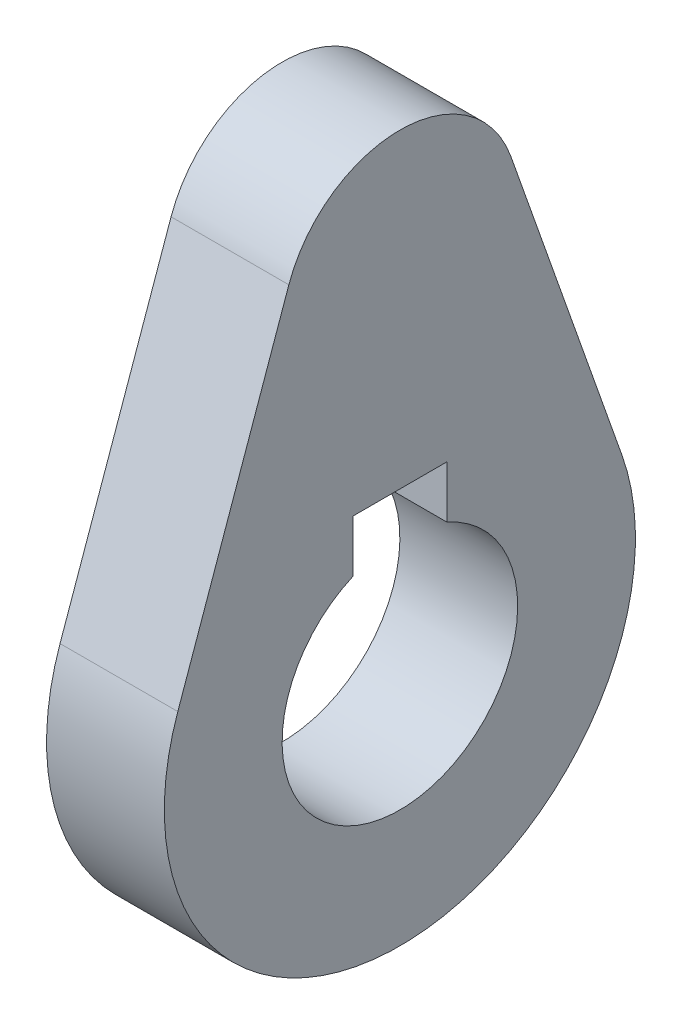
ISO-10303-21;
HEADER;
FILE_DESCRIPTION(('STEP AP214'),'2;1');
FILE_NAME('part.step','',(''),(''),'','','');
FILE_SCHEMA(('AUTOMOTIVE_DESIGN { 1 0 10303 214 1 1 1 1 }'));
ENDSEC;
DATA;
#1=APPLICATION_CONTEXT('core data for automotive mechanical design processes');
#2=APPLICATION_PROTOCOL_DEFINITION('international standard','automotive_design',2000,#1);
#3=PRODUCT_CONTEXT('',#1,'mechanical');
#4=PRODUCT('Part','Part','',(#3));
#5=PRODUCT_RELATED_PRODUCT_CATEGORY('part','',(#4));
#6=PRODUCT_DEFINITION_FORMATION('','',#4);
#7=PRODUCT_DEFINITION_CONTEXT('part definition',#1,'design');
#8=PRODUCT_DEFINITION('design','',#6,#7);
#9=PRODUCT_DEFINITION_SHAPE('','',#8);
#10=(LENGTH_UNIT() NAMED_UNIT(*) SI_UNIT(.MILLI.,.METRE.));
#11=(NAMED_UNIT(*) PLANE_ANGLE_UNIT() SI_UNIT($,.RADIAN.));
#12=(NAMED_UNIT(*) SI_UNIT($,.STERADIAN.) SOLID_ANGLE_UNIT());
#13=UNCERTAINTY_MEASURE_WITH_UNIT(LENGTH_MEASURE(1.E-05),#10,'distance_accuracy_value','');
#14=(GEOMETRIC_REPRESENTATION_CONTEXT(3) GLOBAL_UNCERTAINTY_ASSIGNED_CONTEXT((#13)) GLOBAL_UNIT_ASSIGNED_CONTEXT((#10,
#11,#12)) REPRESENTATION_CONTEXT('',''));
#15=CARTESIAN_POINT('',(0.,0.,0.));
#16=DIRECTION('',(0.,0.,1.));
#17=DIRECTION('',(1.,0.,0.));
#18=AXIS2_PLACEMENT_3D('',#15,#16,#17);
#19=CARTESIAN_POINT('',(5.,0.,0.));
#20=DIRECTION('',(-1.,0.,0.));
#21=DIRECTION('',(0.,0.,1.));
#22=AXIS2_PLACEMENT_3D('',#19,#20,#21);
#23=CYLINDRICAL_SURFACE('',#22,10.);
#24=CARTESIAN_POINT('',(0.,0.,0.));
#25=DIRECTION('',(1.,0.,0.));
#26=DIRECTION('',(0.,0.,-1.));
#27=AXIS2_PLACEMENT_3D('',#24,#25,#26);
#28=CIRCLE('',#27,10.);
#29=CARTESIAN_POINT('',(0.,3.33333333333333,9.42809041582063));
#30=VERTEX_POINT('',#29);
#31=CARTESIAN_POINT('',(0.,3.33333333333333,-9.42809041582064));
#32=VERTEX_POINT('',#31);
#33=EDGE_CURVE('E144',#30,#32,#28,.T.);
#34=ORIENTED_EDGE('',*,*,#33,.T.);
#35=DIRECTION('',(-1.,0.,0.));
#36=VECTOR('',#35,1.);
#37=CARTESIAN_POINT('',(5.,3.33333333333333,-9.42809041582064));
#38=LINE('',#37,#36);
#39=CARTESIAN_POINT('',(5.,3.33333333333333,-9.42809041582064));
#40=VERTEX_POINT('',#39);
#41=EDGE_CURVE('E11',#40,#32,#38,.T.);
#42=ORIENTED_EDGE('',*,*,#41,.F.);
#43=CARTESIAN_POINT('',(5.,0.,0.));
#44=DIRECTION('',(1.,0.,0.));
#45=DIRECTION('',(0.,0.,-1.));
#46=AXIS2_PLACEMENT_3D('',#43,#44,#45);
#47=CIRCLE('',#46,10.);
#48=CARTESIAN_POINT('',(5.,3.33333333333333,9.42809041582063));
#49=VERTEX_POINT('',#48);
#50=EDGE_CURVE('E123',#49,#40,#47,.T.);
#51=ORIENTED_EDGE('',*,*,#50,.F.);
#52=DIRECTION('',(-1.,0.,0.));
#53=VECTOR('',#52,1.);
#54=CARTESIAN_POINT('',(5.,3.33333333333333,9.42809041582063));
#55=LINE('',#54,#53);
#56=EDGE_CURVE('E151',#49,#30,#55,.T.);
#57=ORIENTED_EDGE('',*,*,#56,.T.);
#58=EDGE_LOOP('',(#34,#42,#51,#57));
#59=FACE_BOUND('',#58,.T.);
#60=ADVANCED_FACE('F35',(#59),#23,.T.);
#61=CARTESIAN_POINT('',(5.,3.33333333333333,-9.42809041582064));
#62=DIRECTION('',(0.,0.333333333333333,-0.942809041582063));
#63=DIRECTION('',(0.,0.942809041582063,0.333333333333333));
#64=AXIS2_PLACEMENT_3D('',#61,#62,#63);
#65=PLANE('',#64);
#66=DIRECTION('',(0.,-0.942809041582063,-0.333333333333333));
#67=VECTOR('',#66,1.);
#68=CARTESIAN_POINT('',(0.,3.33333333333333,-9.42809041582064));
#69=LINE('',#68,#67);
#70=CARTESIAN_POINT('',(0.,16.6666666666667,-4.71404520791032));
#71=VERTEX_POINT('',#70);
#72=EDGE_CURVE('E115',#71,#32,#69,.T.);
#73=ORIENTED_EDGE('',*,*,#72,.F.);
#74=DIRECTION('',(-1.,0.,0.));
#75=VECTOR('',#74,1.);
#76=CARTESIAN_POINT('',(5.,16.6666666666667,-4.71404520791032));
#77=LINE('',#76,#75);
#78=CARTESIAN_POINT('',(5.,16.6666666666667,-4.71404520791032));
#79=VERTEX_POINT('',#78);
#80=EDGE_CURVE('E45',#79,#71,#77,.T.);
#81=ORIENTED_EDGE('',*,*,#80,.F.);
#82=DIRECTION('',(0.,-0.942809041582063,-0.333333333333333));
#83=VECTOR('',#82,1.);
#84=CARTESIAN_POINT('',(5.,3.33333333333333,-9.42809041582064));
#85=LINE('',#84,#83);
#86=EDGE_CURVE('E113',#79,#40,#85,.T.);
#87=ORIENTED_EDGE('',*,*,#86,.T.);
#88=ORIENTED_EDGE('',*,*,#41,.T.);
#89=EDGE_LOOP('',(#73,#81,#87,#88));
#90=FACE_BOUND('',#89,.T.);
#91=ADVANCED_FACE('F111',(#90),#65,.T.);
#92=CARTESIAN_POINT('',(5.,15.,0.));
#93=DIRECTION('',(-1.,0.,0.));
#94=DIRECTION('',(0.,0.,1.));
#95=AXIS2_PLACEMENT_3D('',#92,#93,#94);
#96=CYLINDRICAL_SURFACE('',#95,5.);
#97=CARTESIAN_POINT('',(0.,15.,0.));
#98=DIRECTION('',(1.,0.,0.));
#99=DIRECTION('',(0.,0.,-1.));
#100=AXIS2_PLACEMENT_3D('',#97,#98,#99);
#101=CIRCLE('',#100,5.);
#102=CARTESIAN_POINT('',(0.,16.6666666666667,4.71404520791032));
#103=VERTEX_POINT('',#102);
#104=EDGE_CURVE('E81',#71,#103,#101,.T.);
#105=ORIENTED_EDGE('',*,*,#104,.T.);
#106=DIRECTION('',(-1.,0.,0.));
#107=VECTOR('',#106,1.);
#108=CARTESIAN_POINT('',(5.,16.6666666666667,4.71404520791032));
#109=LINE('',#108,#107);
#110=CARTESIAN_POINT('',(5.,16.6666666666667,4.71404520791032));
#111=VERTEX_POINT('',#110);
#112=EDGE_CURVE('E116',#111,#103,#109,.T.);
#113=ORIENTED_EDGE('',*,*,#112,.F.);
#114=CARTESIAN_POINT('',(5.,15.,0.));
#115=DIRECTION('',(1.,0.,0.));
#116=DIRECTION('',(0.,0.,-1.));
#117=AXIS2_PLACEMENT_3D('',#114,#115,#116);
#118=CIRCLE('',#117,5.);
#119=EDGE_CURVE('E118',#79,#111,#118,.T.);
#120=ORIENTED_EDGE('',*,*,#119,.F.);
#121=ORIENTED_EDGE('',*,*,#80,.T.);
#122=EDGE_LOOP('',(#105,#113,#120,#121));
#123=FACE_BOUND('',#122,.T.);
#124=ADVANCED_FACE('F119',(#123),#96,.T.);
#125=CARTESIAN_POINT('',(5.,0.,0.));
#126=DIRECTION('',(-1.,0.,0.));
#127=DIRECTION('',(0.,0.,1.));
#128=AXIS2_PLACEMENT_3D('',#125,#126,#127);
#129=CYLINDRICAL_SURFACE('',#128,5.);
#130=CARTESIAN_POINT('',(0.,0.,0.));
#131=DIRECTION('',(1.,0.,0.));
#132=DIRECTION('',(0.,0.,-1.));
#133=AXIS2_PLACEMENT_3D('',#130,#131,#132);
#134=CIRCLE('',#133,5.);
#135=CARTESIAN_POINT('',(0.,4.58257569495584,2.));
#136=VERTEX_POINT('',#135);
#137=CARTESIAN_POINT('',(0.,4.58257569495584,-2.));
#138=VERTEX_POINT('',#137);
#139=EDGE_CURVE('E132',#136,#138,#134,.T.);
#140=ORIENTED_EDGE('',*,*,#139,.F.);
#141=DIRECTION('',(-1.,0.,0.));
#142=VECTOR('',#141,1.);
#143=CARTESIAN_POINT('',(5.,4.58257569495584,2.));
#144=LINE('',#143,#142);
#145=CARTESIAN_POINT('',(5.,4.58257569495584,2.));
#146=VERTEX_POINT('',#145);
#147=EDGE_CURVE('E39',#146,#136,#144,.T.);
#148=ORIENTED_EDGE('',*,*,#147,.F.);
#149=CARTESIAN_POINT('',(5.,0.,0.));
#150=DIRECTION('',(1.,0.,0.));
#151=DIRECTION('',(0.,0.,-1.));
#152=AXIS2_PLACEMENT_3D('',#149,#150,#151);
#153=CIRCLE('',#152,5.);
#154=CARTESIAN_POINT('',(5.,4.58257569495584,-2.));
#155=VERTEX_POINT('',#154);
#156=EDGE_CURVE('E150',#146,#155,#153,.T.);
#157=ORIENTED_EDGE('',*,*,#156,.T.);
#158=DIRECTION('',(-1.,0.,0.));
#159=VECTOR('',#158,1.);
#160=CARTESIAN_POINT('',(5.,4.58257569495584,-2.));
#161=LINE('',#160,#159);
#162=EDGE_CURVE('E131',#155,#138,#161,.T.);
#163=ORIENTED_EDGE('',*,*,#162,.T.);
#164=EDGE_LOOP('',(#140,#148,#157,#163));
#165=FACE_BOUND('',#164,.T.);
#166=ADVANCED_FACE('F37',(#165),#129,.F.);
#167=CARTESIAN_POINT('',(5.,0.,2.));
#168=DIRECTION('',(0.,0.,1.));
#169=DIRECTION('',(1.,0.,0.));
#170=AXIS2_PLACEMENT_3D('',#167,#168,#169);
#171=PLANE('',#170);
#172=DIRECTION('',(0.,1.,0.));
#173=VECTOR('',#172,1.);
#174=CARTESIAN_POINT('',(0.,0.,2.));
#175=LINE('',#174,#173);
#176=CARTESIAN_POINT('',(0.,6.80206586266261,2.));
#177=VERTEX_POINT('',#176);
#178=EDGE_CURVE('E135',#136,#177,#175,.T.);
#179=ORIENTED_EDGE('',*,*,#178,.T.);
#180=DIRECTION('',(-1.,0.,0.));
#181=VECTOR('',#180,1.);
#182=CARTESIAN_POINT('',(5.,6.80206586266261,2.));
#183=LINE('',#182,#181);
#184=CARTESIAN_POINT('',(5.,6.80206586266261,2.));
#185=VERTEX_POINT('',#184);
#186=EDGE_CURVE('E156',#185,#177,#183,.T.);
#187=ORIENTED_EDGE('',*,*,#186,.F.);
#188=DIRECTION('',(0.,1.,0.));
#189=VECTOR('',#188,1.);
#190=CARTESIAN_POINT('',(5.,0.,2.));
#191=LINE('',#190,#189);
#192=EDGE_CURVE('E164',#146,#185,#191,.T.);
#193=ORIENTED_EDGE('',*,*,#192,.F.);
#194=ORIENTED_EDGE('',*,*,#147,.T.);
#195=EDGE_LOOP('',(#179,#187,#193,#194));
#196=FACE_BOUND('',#195,.T.);
#197=ADVANCED_FACE('F163',(#196),#171,.F.);
#198=CARTESIAN_POINT('',(5.,6.80206586266261,0.));
#199=DIRECTION('',(0.,-1.,0.));
#200=DIRECTION('',(0.,0.,-1.));
#201=AXIS2_PLACEMENT_3D('',#198,#199,#200);
#202=PLANE('',#201);
#203=DIRECTION('',(0.,0.,1.));
#204=VECTOR('',#203,1.);
#205=CARTESIAN_POINT('',(0.,6.80206586266261,0.));
#206=LINE('',#205,#204);
#207=CARTESIAN_POINT('',(0.,6.80206586266261,-2.));
#208=VERTEX_POINT('',#207);
#209=EDGE_CURVE('E138',#208,#177,#206,.T.);
#210=ORIENTED_EDGE('',*,*,#209,.F.);
#211=DIRECTION('',(-1.,0.,0.));
#212=VECTOR('',#211,1.);
#213=CARTESIAN_POINT('',(5.,6.80206586266261,-2.));
#214=LINE('',#213,#212);
#215=CARTESIAN_POINT('',(5.,6.80206586266261,-2.));
#216=VERTEX_POINT('',#215);
#217=EDGE_CURVE('E155',#216,#208,#214,.T.);
#218=ORIENTED_EDGE('',*,*,#217,.F.);
#219=DIRECTION('',(0.,0.,1.));
#220=VECTOR('',#219,1.);
#221=CARTESIAN_POINT('',(5.,6.80206586266261,0.));
#222=LINE('',#221,#220);
#223=EDGE_CURVE('E203',#216,#185,#222,.T.);
#224=ORIENTED_EDGE('',*,*,#223,.T.);
#225=ORIENTED_EDGE('',*,*,#186,.T.);
#226=EDGE_LOOP('',(#210,#218,#224,#225));
#227=FACE_BOUND('',#226,.T.);
#228=ADVANCED_FACE('F175',(#227),#202,.T.);
#229=CARTESIAN_POINT('',(5.,0.,-2.));
#230=DIRECTION('',(0.,0.,1.));
#231=DIRECTION('',(0.,-1.,0.));
#232=AXIS2_PLACEMENT_3D('',#229,#230,#231);
#233=PLANE('',#232);
#234=DIRECTION('',(0.,1.,0.));
#235=VECTOR('',#234,1.);
#236=CARTESIAN_POINT('',(0.,0.,-2.));
#237=LINE('',#236,#235);
#238=EDGE_CURVE('E141',#138,#208,#237,.T.);
#239=ORIENTED_EDGE('',*,*,#238,.F.);
#240=ORIENTED_EDGE('',*,*,#162,.F.);
#241=DIRECTION('',(0.,1.,0.));
#242=VECTOR('',#241,1.);
#243=CARTESIAN_POINT('',(5.,0.,-2.));
#244=LINE('',#243,#242);
#245=EDGE_CURVE('E126',#155,#216,#244,.T.);
#246=ORIENTED_EDGE('',*,*,#245,.T.);
#247=ORIENTED_EDGE('',*,*,#217,.T.);
#248=EDGE_LOOP('',(#239,#240,#246,#247));
#249=FACE_BOUND('',#248,.T.);
#250=ADVANCED_FACE('F173',(#249),#233,.T.);
#251=CARTESIAN_POINT('',(5.,3.33333333333333,9.42809041582063));
#252=DIRECTION('',(0.,-0.333333333333333,-0.942809041582063));
#253=DIRECTION('',(0.,0.942809041582063,-0.333333333333333));
#254=AXIS2_PLACEMENT_3D('',#251,#252,#253);
#255=PLANE('',#254);
#256=DIRECTION('',(0.,-0.942809041582063,0.333333333333333));
#257=VECTOR('',#256,1.);
#258=CARTESIAN_POINT('',(0.,3.33333333333333,9.42809041582063));
#259=LINE('',#258,#257);
#260=EDGE_CURVE('E87',#103,#30,#259,.T.);
#261=ORIENTED_EDGE('',*,*,#260,.T.);
#262=ORIENTED_EDGE('',*,*,#56,.F.);
#263=DIRECTION('',(0.,-0.942809041582063,0.333333333333333));
#264=VECTOR('',#263,1.);
#265=CARTESIAN_POINT('',(5.,3.33333333333333,9.42809041582063));
#266=LINE('',#265,#264);
#267=EDGE_CURVE('E54',#111,#49,#266,.T.);
#268=ORIENTED_EDGE('',*,*,#267,.F.);
#269=ORIENTED_EDGE('',*,*,#112,.T.);
#270=EDGE_LOOP('',(#261,#262,#268,#269));
#271=FACE_BOUND('',#270,.T.);
#272=ADVANCED_FACE('F182',(#271),#255,.F.);
#273=CARTESIAN_POINT('',(5.,0.,0.));
#274=DIRECTION('',(1.,0.,0.));
#275=DIRECTION('',(0.,0.,-1.));
#276=AXIS2_PLACEMENT_3D('',#273,#274,#275);
#277=PLANE('',#276);
#278=ORIENTED_EDGE('',*,*,#156,.F.);
#279=ORIENTED_EDGE('',*,*,#192,.T.);
#280=ORIENTED_EDGE('',*,*,#223,.F.);
#281=ORIENTED_EDGE('',*,*,#245,.F.);
#282=EDGE_LOOP('',(#278,#279,#280,#281));
#283=FACE_BOUND('',#282,.T.);
#284=ORIENTED_EDGE('',*,*,#50,.T.);
#285=ORIENTED_EDGE('',*,*,#86,.F.);
#286=ORIENTED_EDGE('',*,*,#119,.T.);
#287=ORIENTED_EDGE('',*,*,#267,.T.);
#288=EDGE_LOOP('',(#284,#285,#286,#287));
#289=FACE_BOUND('',#288,.T.);
#290=ADVANCED_FACE('F121',(#283,#289),#277,.T.);
#291=CARTESIAN_POINT('',(0.,0.,0.));
#292=DIRECTION('',(1.,0.,0.));
#293=DIRECTION('',(0.,0.,-1.));
#294=AXIS2_PLACEMENT_3D('',#291,#292,#293);
#295=PLANE('',#294);
#296=ORIENTED_EDGE('',*,*,#139,.T.);
#297=ORIENTED_EDGE('',*,*,#238,.T.);
#298=ORIENTED_EDGE('',*,*,#209,.T.);
#299=ORIENTED_EDGE('',*,*,#178,.F.);
#300=EDGE_LOOP('',(#296,#297,#298,#299));
#301=FACE_BOUND('',#300,.T.);
#302=ORIENTED_EDGE('',*,*,#33,.F.);
#303=ORIENTED_EDGE('',*,*,#260,.F.);
#304=ORIENTED_EDGE('',*,*,#104,.F.);
#305=ORIENTED_EDGE('',*,*,#72,.T.);
#306=EDGE_LOOP('',(#302,#303,#304,#305));
#307=FACE_BOUND('',#306,.T.);
#308=ADVANCED_FACE('F167',(#301,#307),#295,.F.);
#309=CLOSED_SHELL('',(#60,#91,#124,#166,#197,#228,#250,#272,#290,#308));
#310=MANIFOLD_SOLID_BREP('B2',#309);
#311=ADVANCED_BREP_SHAPE_REPRESENTATION('',(#18,#310),#14);
#312=SHAPE_DEFINITION_REPRESENTATION(#9,#311);
ENDSEC;
END-ISO-10303-21;
